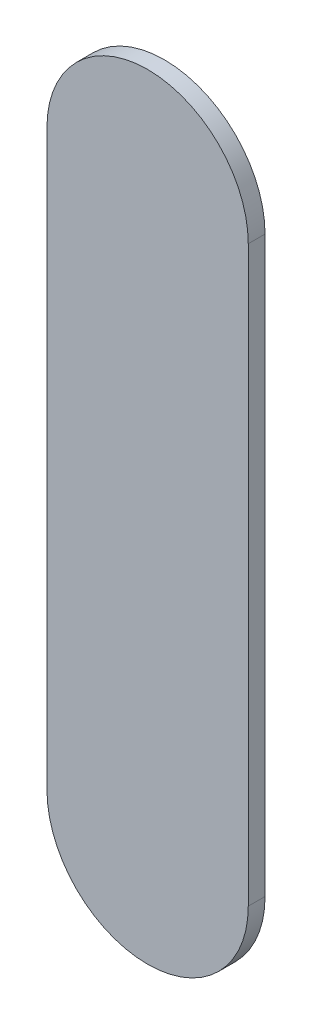
ISO-10303-21;
HEADER;
FILE_DESCRIPTION(('STEP AP214'),'2;1');
FILE_NAME('part.step','',(''),(''),'','','');
FILE_SCHEMA(('AUTOMOTIVE_DESIGN { 1 0 10303 214 1 1 1 1 }'));
ENDSEC;
DATA;
#1=APPLICATION_CONTEXT('core data for automotive mechanical design processes');
#2=APPLICATION_PROTOCOL_DEFINITION('international standard','automotive_design',2000,#1);
#3=PRODUCT_CONTEXT('',#1,'mechanical');
#4=PRODUCT('Part','Part','',(#3));
#5=PRODUCT_RELATED_PRODUCT_CATEGORY('part','',(#4));
#6=PRODUCT_DEFINITION_FORMATION('','',#4);
#7=PRODUCT_DEFINITION_CONTEXT('part definition',#1,'design');
#8=PRODUCT_DEFINITION('design','',#6,#7);
#9=PRODUCT_DEFINITION_SHAPE('','',#8);
#10=(LENGTH_UNIT() NAMED_UNIT(*) SI_UNIT(.MILLI.,.METRE.));
#11=(NAMED_UNIT(*) PLANE_ANGLE_UNIT() SI_UNIT($,.RADIAN.));
#12=(NAMED_UNIT(*) SI_UNIT($,.STERADIAN.) SOLID_ANGLE_UNIT());
#13=UNCERTAINTY_MEASURE_WITH_UNIT(LENGTH_MEASURE(1.E-05),#10,'distance_accuracy_value','');
#14=(GEOMETRIC_REPRESENTATION_CONTEXT(3) GLOBAL_UNCERTAINTY_ASSIGNED_CONTEXT((#13)) GLOBAL_UNIT_ASSIGNED_CONTEXT((#10,
#11,#12)) REPRESENTATION_CONTEXT('',''));
#15=CARTESIAN_POINT('',(0.,0.,0.));
#16=DIRECTION('',(0.,0.,1.));
#17=DIRECTION('',(1.,0.,0.));
#18=AXIS2_PLACEMENT_3D('',#15,#16,#17);
#19=CARTESIAN_POINT('',(37.852999267578,53.349848632812,1.1723000001));
#20=DIRECTION('',(0.,0.,1.));
#21=DIRECTION('',(1.,0.,0.));
#22=AXIS2_PLACEMENT_3D('',#19,#20,#21);
#23=PLANE('',#22);
#24=CARTESIAN_POINT('',(37.852999267578,53.132698974609,1.1723000001));
#25=DIRECTION('',(0.,0.,-1.));
#26=DIRECTION('',(1.,0.,0.));
#27=AXIS2_PLACEMENT_3D('',#24,#25,#26);
#28=CIRCLE('',#27,0.07619995118165);
#29=CARTESIAN_POINT('',(37.92919921875,53.132699584961,1.1723000001));
#30=VERTEX_POINT('',#29);
#31=CARTESIAN_POINT('',(37.776799316401,53.132698974609,1.1723000001));
#32=VERTEX_POINT('',#31);
#33=EDGE_CURVE('E71',#30,#32,#28,.T.);
#34=ORIENTED_EDGE('',*,*,#33,.F.);
#35=DIRECTION('',(0.,1.,0.));
#36=VECTOR('',#35,1.);
#37=CARTESIAN_POINT('',(37.92919921875,53.566997070312,1.1723000001));
#38=LINE('',#37,#36);
#39=CARTESIAN_POINT('',(37.929199218755,53.566998291016,1.1723000001));
#40=VERTEX_POINT('',#39);
#41=EDGE_CURVE('E97',#30,#40,#38,.T.);
#42=ORIENTED_EDGE('',*,*,#41,.T.);
#43=CARTESIAN_POINT('',(37.852999267578,53.566998291016,1.1723000001));
#44=DIRECTION('',(0.,0.,-1.));
#45=DIRECTION('',(1.,0.,0.));
#46=AXIS2_PLACEMENT_3D('',#43,#44,#45);
#47=CIRCLE('',#46,0.07619995118165);
#48=CARTESIAN_POINT('',(37.776799316406,53.566997680664,1.1723000001));
#49=VERTEX_POINT('',#48);
#50=EDGE_CURVE('E102',#49,#40,#47,.T.);
#51=ORIENTED_EDGE('',*,*,#50,.F.);
#52=DIRECTION('',(0.,-1.,0.));
#53=VECTOR('',#52,1.);
#54=CARTESIAN_POINT('',(37.776799316406,53.132700195312,1.1723000001));
#55=LINE('',#54,#53);
#56=EDGE_CURVE('E11',#49,#32,#55,.T.);
#57=ORIENTED_EDGE('',*,*,#56,.T.);
#58=EDGE_LOOP('',(#34,#42,#51,#57));
#59=FACE_BOUND('',#58,.T.);
#60=ADVANCED_FACE('F17',(#59),#23,.T.);
#61=CARTESIAN_POINT('',(37.776799316406,53.132700195312,1.1596000001));
#62=DIRECTION('',(1.,0.,0.));
#63=DIRECTION('',(0.,1.,0.));
#64=AXIS2_PLACEMENT_3D('',#61,#62,#63);
#65=PLANE('',#64);
#66=DIRECTION('',(0.,0.,1.));
#67=VECTOR('',#66,1.);
#68=CARTESIAN_POINT('',(37.776799316406,53.566997070312,1.1596000001));
#69=LINE('',#68,#67);
#70=CARTESIAN_POINT('',(37.776799316406,53.566997680664,1.1596000001));
#71=VERTEX_POINT('',#70);
#72=EDGE_CURVE('E21',#71,#49,#69,.T.);
#73=ORIENTED_EDGE('',*,*,#72,.F.);
#74=DIRECTION('',(0.,-1.,0.));
#75=VECTOR('',#74,1.);
#76=CARTESIAN_POINT('',(37.776799316406,53.349848632812,1.1596000001));
#77=LINE('',#76,#75);
#78=CARTESIAN_POINT('',(37.776799316401,53.132698974609,1.1596000001));
#79=VERTEX_POINT('',#78);
#80=EDGE_CURVE('E76',#71,#79,#77,.T.);
#81=ORIENTED_EDGE('',*,*,#80,.T.);
#82=DIRECTION('',(0.,0.,-1.));
#83=VECTOR('',#82,1.);
#84=CARTESIAN_POINT('',(37.776799316396,53.132698974609,1.1596000001));
#85=LINE('',#84,#83);
#86=EDGE_CURVE('E28',#32,#79,#85,.T.);
#87=ORIENTED_EDGE('',*,*,#86,.F.);
#88=ORIENTED_EDGE('',*,*,#56,.F.);
#89=EDGE_LOOP('',(#73,#81,#87,#88));
#90=FACE_BOUND('',#89,.T.);
#91=ADVANCED_FACE('F77',(#90),#65,.F.);
#92=CARTESIAN_POINT('',(37.852999267578,53.132698974609,1.1596000001));
#93=DIRECTION('',(0.,0.,1.));
#94=DIRECTION('',(1.,0.,0.));
#95=AXIS2_PLACEMENT_3D('',#92,#93,#94);
#96=CYLINDRICAL_SURFACE('',#95,0.07619995118165);
#97=DIRECTION('',(0.,0.,1.));
#98=VECTOR('',#97,1.);
#99=CARTESIAN_POINT('',(37.92919921875,53.132700195312,1.1596000001));
#100=LINE('',#99,#98);
#101=CARTESIAN_POINT('',(37.92919921875,53.132699584961,1.1596000001));
#102=VERTEX_POINT('',#101);
#103=EDGE_CURVE('E100',#102,#30,#100,.T.);
#104=ORIENTED_EDGE('',*,*,#103,.T.);
#105=ORIENTED_EDGE('',*,*,#33,.T.);
#106=ORIENTED_EDGE('',*,*,#86,.T.);
#107=CARTESIAN_POINT('',(37.852999267578,53.132698974609,1.1596000001));
#108=DIRECTION('',(0.,0.,1.));
#109=DIRECTION('',(1.,0.,0.));
#110=AXIS2_PLACEMENT_3D('',#107,#108,#109);
#111=CIRCLE('',#110,0.07619995118165);
#112=EDGE_CURVE('E69',#79,#102,#111,.T.);
#113=ORIENTED_EDGE('',*,*,#112,.T.);
#114=EDGE_LOOP('',(#104,#105,#106,#113));
#115=FACE_BOUND('',#114,.T.);
#116=ADVANCED_FACE('F19',(#115),#96,.T.);
#117=CARTESIAN_POINT('',(37.92919921875,53.566997070312,1.1596000001));
#118=DIRECTION('',(-1.,0.,0.));
#119=DIRECTION('',(0.,0.,1.));
#120=AXIS2_PLACEMENT_3D('',#117,#118,#119);
#121=PLANE('',#120);
#122=ORIENTED_EDGE('',*,*,#103,.F.);
#123=DIRECTION('',(0.,1.,0.));
#124=VECTOR('',#123,1.);
#125=CARTESIAN_POINT('',(37.92919921875,53.349848632812,1.1596000001));
#126=LINE('',#125,#124);
#127=CARTESIAN_POINT('',(37.929199218755,53.566998291016,1.1596000001));
#128=VERTEX_POINT('',#127);
#129=EDGE_CURVE('E87',#102,#128,#126,.T.);
#130=ORIENTED_EDGE('',*,*,#129,.T.);
#131=DIRECTION('',(0.,0.,-1.));
#132=VECTOR('',#131,1.);
#133=CARTESIAN_POINT('',(37.92919921876,53.566998291016,1.1596000001));
#134=LINE('',#133,#132);
#135=EDGE_CURVE('E105',#40,#128,#134,.T.);
#136=ORIENTED_EDGE('',*,*,#135,.F.);
#137=ORIENTED_EDGE('',*,*,#41,.F.);
#138=EDGE_LOOP('',(#122,#130,#136,#137));
#139=FACE_BOUND('',#138,.T.);
#140=ADVANCED_FACE('F125',(#139),#121,.F.);
#141=CARTESIAN_POINT('',(37.852999267578,53.566998291016,1.1596000001));
#142=DIRECTION('',(0.,0.,1.));
#143=DIRECTION('',(1.,0.,0.));
#144=AXIS2_PLACEMENT_3D('',#141,#142,#143);
#145=CYLINDRICAL_SURFACE('',#144,0.07619995118165);
#146=ORIENTED_EDGE('',*,*,#72,.T.);
#147=ORIENTED_EDGE('',*,*,#50,.T.);
#148=ORIENTED_EDGE('',*,*,#135,.T.);
#149=CARTESIAN_POINT('',(37.852999267578,53.566998291016,1.1596000001));
#150=DIRECTION('',(0.,0.,1.));
#151=DIRECTION('',(1.,0.,0.));
#152=AXIS2_PLACEMENT_3D('',#149,#150,#151);
#153=CIRCLE('',#152,0.07619995118165);
#154=EDGE_CURVE('E83',#128,#71,#153,.T.);
#155=ORIENTED_EDGE('',*,*,#154,.T.);
#156=EDGE_LOOP('',(#146,#147,#148,#155));
#157=FACE_BOUND('',#156,.T.);
#158=ADVANCED_FACE('F122',(#157),#145,.T.);
#159=CARTESIAN_POINT('',(37.852999267578,53.349848632812,1.1596000001));
#160=DIRECTION('',(0.,0.,1.));
#161=DIRECTION('',(1.,0.,0.));
#162=AXIS2_PLACEMENT_3D('',#159,#160,#161);
#163=PLANE('',#162);
#164=ORIENTED_EDGE('',*,*,#129,.F.);
#165=ORIENTED_EDGE('',*,*,#112,.F.);
#166=ORIENTED_EDGE('',*,*,#80,.F.);
#167=ORIENTED_EDGE('',*,*,#154,.F.);
#168=EDGE_LOOP('',(#164,#165,#166,#167));
#169=FACE_BOUND('',#168,.T.);
#170=ADVANCED_FACE('F85',(#169),#163,.F.);
#171=CLOSED_SHELL('',(#60,#91,#116,#140,#158,#170));
#172=MANIFOLD_SOLID_BREP('B1',#171);
#173=ADVANCED_BREP_SHAPE_REPRESENTATION('',(#18,#172),#14);
#174=SHAPE_DEFINITION_REPRESENTATION(#9,#173);
ENDSEC;
END-ISO-10303-21;
